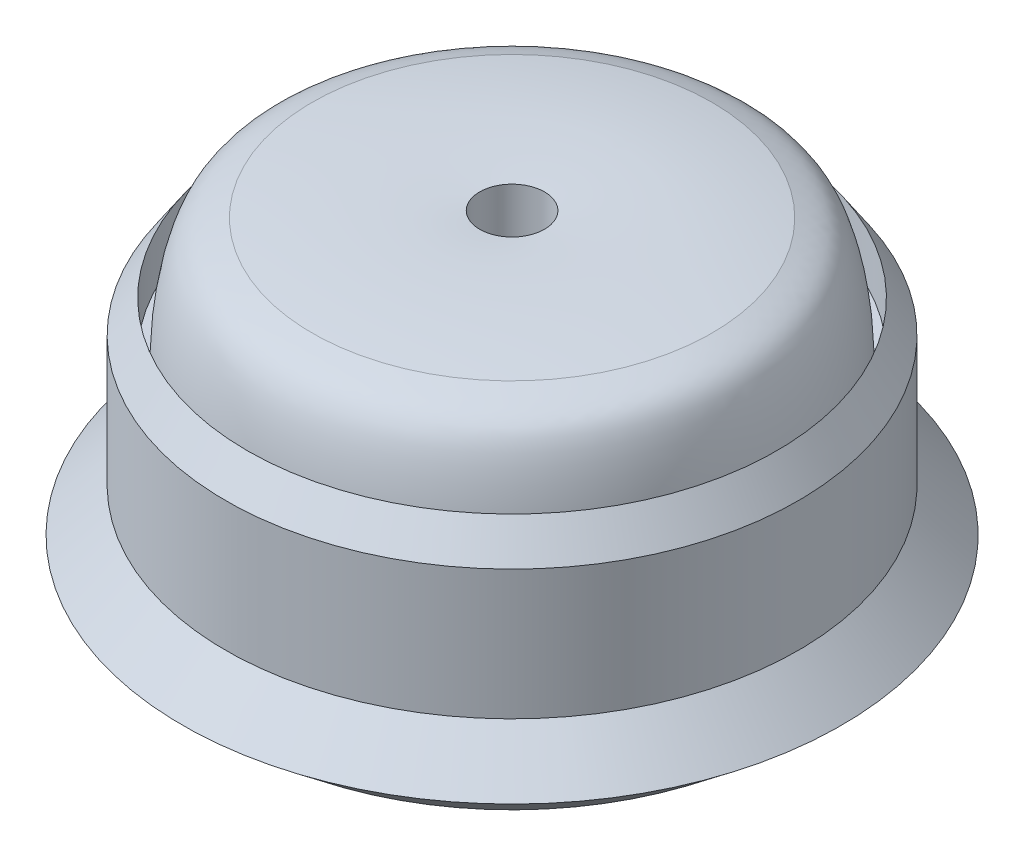
ISO-10303-21;
HEADER;
FILE_DESCRIPTION(('STEP AP214'),'2;1');
FILE_NAME('part.step','',(''),(''),'','','');
FILE_SCHEMA(('AUTOMOTIVE_DESIGN { 1 0 10303 214 1 1 1 1 }'));
ENDSEC;
DATA;
#1=APPLICATION_CONTEXT('core data for automotive mechanical design processes');
#2=APPLICATION_PROTOCOL_DEFINITION('international standard','automotive_design',2000,#1);
#3=PRODUCT_CONTEXT('',#1,'mechanical');
#4=PRODUCT('Part','Part','',(#3));
#5=PRODUCT_RELATED_PRODUCT_CATEGORY('part','',(#4));
#6=PRODUCT_DEFINITION_FORMATION('','',#4);
#7=PRODUCT_DEFINITION_CONTEXT('part definition',#1,'design');
#8=PRODUCT_DEFINITION('design','',#6,#7);
#9=PRODUCT_DEFINITION_SHAPE('','',#8);
#10=(LENGTH_UNIT() NAMED_UNIT(*) SI_UNIT(.MILLI.,.METRE.));
#11=(NAMED_UNIT(*) PLANE_ANGLE_UNIT() SI_UNIT($,.RADIAN.));
#12=(NAMED_UNIT(*) SI_UNIT($,.STERADIAN.) SOLID_ANGLE_UNIT());
#13=UNCERTAINTY_MEASURE_WITH_UNIT(LENGTH_MEASURE(1.E-05),#10,'distance_accuracy_value','');
#14=(GEOMETRIC_REPRESENTATION_CONTEXT(3) GLOBAL_UNCERTAINTY_ASSIGNED_CONTEXT((#13)) GLOBAL_UNIT_ASSIGNED_CONTEXT((#10,
#11,#12)) REPRESENTATION_CONTEXT('',''));
#15=CARTESIAN_POINT('',(0.,0.,0.));
#16=DIRECTION('',(0.,0.,1.));
#17=DIRECTION('',(1.,0.,0.));
#18=AXIS2_PLACEMENT_3D('',#15,#16,#17);
#19=CARTESIAN_POINT('',(18.5,29.4293040714932,0.));
#20=CARTESIAN_POINT('',(20.5119372775493,28.706105263246,0.));
#21=CARTESIAN_POINT('',(22.7386325654309,27.8723713239317,0.));
#22=CARTESIAN_POINT('',(23.7839045522029,20.5596077408684,0.));
#23=CARTESIAN_POINT('',(23.7,17.2047092559107,0.));
#24=B_SPLINE_CURVE_WITH_KNOTS('',3,(#19,#20,#21,#22,#23),.UNSPECIFIED.,.F.,.F.,(4,1,4),(0.,
0.382453263538425,1.),.UNSPECIFIED.);
#25=CARTESIAN_POINT('',(0.,0.,0.));
#26=DIRECTION('',(0.,-1.,0.));
#27=AXIS1_PLACEMENT('',#25,#26);
#28=SURFACE_OF_REVOLUTION('',#24,#27);
#29=CARTESIAN_POINT('',(0.,18.4216589861751,0.));
#30=DIRECTION('',(0.,-1.,0.));
#31=DIRECTION('',(0.,0.,-1.));
#32=AXIS2_PLACEMENT_3D('',#29,#30,#31);
#33=CIRCLE('',#32,23.7);
#34=CARTESIAN_POINT('',(0.,18.4216589861751,-23.7));
#35=VERTEX_POINT('',#34);
#36=EDGE_CURVE('E88',#35,#35,#33,.T.);
#37=ORIENTED_EDGE('',*,*,#36,.F.);
#38=EDGE_LOOP('',(#37));
#39=FACE_BOUND('',#38,.T.);
#40=CARTESIAN_POINT('',(0.,29.4293040714932,0.));
#41=DIRECTION('',(0.,-1.,0.));
#42=DIRECTION('',(0.,0.,-1.));
#43=AXIS2_PLACEMENT_3D('',#40,#41,#42);
#44=CIRCLE('',#43,18.5);
#45=CARTESIAN_POINT('',(0.,29.4293040714932,-18.5));
#46=VERTEX_POINT('',#45);
#47=EDGE_CURVE('E10',#46,#46,#44,.T.);
#48=ORIENTED_EDGE('',*,*,#47,.T.);
#49=EDGE_LOOP('',(#48));
#50=FACE_BOUND('',#49,.T.);
#51=ADVANCED_FACE('F35',(#39,#50),#28,.T.);
#52=CARTESIAN_POINT('',(3.,30.,0.));
#53=CARTESIAN_POINT('',(10.8040228911975,30.6291232917202,0.));
#54=CARTESIAN_POINT('',(18.5,29.4293040714932,0.));
#55=B_SPLINE_CURVE_WITH_KNOTS('',2,(#52,#53,#54),.UNSPECIFIED.,.F.,.F.,(3,3),(0.,1.),.UNSPECIFIED.);
#56=CARTESIAN_POINT('',(0.,0.,0.));
#57=DIRECTION('',(0.,-1.,0.));
#58=AXIS1_PLACEMENT('',#56,#57);
#59=SURFACE_OF_REVOLUTION('',#55,#58);
#60=ORIENTED_EDGE('',*,*,#47,.F.);
#61=EDGE_LOOP('',(#60));
#62=FACE_BOUND('',#61,.T.);
#63=CARTESIAN_POINT('',(0.,30.,0.));
#64=DIRECTION('',(0.,-1.,0.));
#65=DIRECTION('',(0.,0.,-1.));
#66=AXIS2_PLACEMENT_3D('',#63,#64,#65);
#67=CIRCLE('',#66,3.);
#68=CARTESIAN_POINT('',(0.,30.,-3.));
#69=VERTEX_POINT('',#68);
#70=EDGE_CURVE('E42',#69,#69,#67,.T.);
#71=ORIENTED_EDGE('',*,*,#70,.T.);
#72=EDGE_LOOP('',(#71));
#73=FACE_BOUND('',#72,.T.);
#74=ADVANCED_FACE('F100',(#62,#73),#59,.T.);
#75=CARTESIAN_POINT('',(0.,0.,0.));
#76=DIRECTION('',(0.,-1.,0.));
#77=DIRECTION('',(0.,0.,-1.));
#78=AXIS2_PLACEMENT_3D('',#75,#76,#77);
#79=CYLINDRICAL_SURFACE('',#78,3.);
#80=CARTESIAN_POINT('',(0.,25.2649769585254,0.));
#81=DIRECTION('',(0.,-1.,0.));
#82=DIRECTION('',(0.,0.,-1.));
#83=AXIS2_PLACEMENT_3D('',#80,#81,#82);
#84=CIRCLE('',#83,3.);
#85=CARTESIAN_POINT('',(0.,25.2649769585254,-3.));
#86=VERTEX_POINT('',#85);
#87=EDGE_CURVE('E46',#86,#86,#84,.T.);
#88=ORIENTED_EDGE('',*,*,#87,.T.);
#89=EDGE_LOOP('',(#88));
#90=FACE_BOUND('',#89,.T.);
#91=ORIENTED_EDGE('',*,*,#70,.F.);
#92=EDGE_LOOP('',(#91));
#93=FACE_BOUND('',#92,.T.);
#94=ADVANCED_FACE('F103',(#90,#93),#79,.F.);
#95=CARTESIAN_POINT('',(0.,25.2649769585254,0.));
#96=DIRECTION('',(0.,-1.,0.));
#97=DIRECTION('',(0.,0.,-1.));
#98=AXIS2_PLACEMENT_3D('',#95,#96,#97);
#99=PLANE('',#98);
#100=CARTESIAN_POINT('',(0.,25.2649769585254,0.));
#101=DIRECTION('',(0.,-1.,0.));
#102=DIRECTION('',(0.,0.,-1.));
#103=AXIS2_PLACEMENT_3D('',#100,#101,#102);
#104=CIRCLE('',#103,5.5);
#105=CARTESIAN_POINT('',(0.,25.2649769585254,-5.5));
#106=VERTEX_POINT('',#105);
#107=EDGE_CURVE('E50',#106,#106,#104,.T.);
#108=ORIENTED_EDGE('',*,*,#107,.T.);
#109=EDGE_LOOP('',(#108));
#110=FACE_BOUND('',#109,.T.);
#111=ORIENTED_EDGE('',*,*,#87,.F.);
#112=EDGE_LOOP('',(#111));
#113=FACE_BOUND('',#112,.T.);
#114=ADVANCED_FACE('F107',(#110,#113),#99,.T.);
#115=CARTESIAN_POINT('',(0.,0.,0.));
#116=DIRECTION('',(0.,-1.,0.));
#117=DIRECTION('',(0.,0.,-1.));
#118=AXIS2_PLACEMENT_3D('',#115,#116,#117);
#119=CYLINDRICAL_SURFACE('',#118,5.5);
#120=CARTESIAN_POINT('',(0.,28.,0.));
#121=DIRECTION('',(0.,-1.,0.));
#122=DIRECTION('',(0.,0.,-1.));
#123=AXIS2_PLACEMENT_3D('',#120,#121,#122);
#124=CIRCLE('',#123,5.5);
#125=CARTESIAN_POINT('',(0.,28.,-5.5));
#126=VERTEX_POINT('',#125);
#127=EDGE_CURVE('E55',#126,#126,#124,.T.);
#128=ORIENTED_EDGE('',*,*,#127,.T.);
#129=EDGE_LOOP('',(#128));
#130=FACE_BOUND('',#129,.T.);
#131=ORIENTED_EDGE('',*,*,#107,.F.);
#132=EDGE_LOOP('',(#131));
#133=FACE_BOUND('',#132,.T.);
#134=ADVANCED_FACE('F111',(#130,#133),#119,.T.);
#135=CARTESIAN_POINT('',(0.,28.,0.));
#136=DIRECTION('',(0.,-1.,0.));
#137=DIRECTION('',(0.,0.,-1.));
#138=AXIS2_PLACEMENT_3D('',#135,#136,#137);
#139=PLANE('',#138);
#140=CARTESIAN_POINT('',(0.,28.,0.));
#141=DIRECTION('',(0.,-1.,0.));
#142=DIRECTION('',(0.,0.,-1.));
#143=AXIS2_PLACEMENT_3D('',#140,#141,#142);
#144=CIRCLE('',#143,18.5);
#145=CARTESIAN_POINT('',(0.,28.,-18.5));
#146=VERTEX_POINT('',#145);
#147=EDGE_CURVE('E58',#146,#146,#144,.T.);
#148=ORIENTED_EDGE('',*,*,#147,.T.);
#149=EDGE_LOOP('',(#148));
#150=FACE_BOUND('',#149,.T.);
#151=ORIENTED_EDGE('',*,*,#127,.F.);
#152=EDGE_LOOP('',(#151));
#153=FACE_BOUND('',#152,.T.);
#154=ADVANCED_FACE('F115',(#150,#153),#139,.T.);
#155=CARTESIAN_POINT('',(0.,0.,0.));
#156=DIRECTION('',(0.,-1.,0.));
#157=DIRECTION('',(0.,0.,-1.));
#158=AXIS2_PLACEMENT_3D('',#155,#156,#157);
#159=CYLINDRICAL_SURFACE('',#158,18.5);
#160=CARTESIAN_POINT('',(0.,17.,0.));
#161=DIRECTION('',(0.,-1.,0.));
#162=DIRECTION('',(0.,0.,-1.));
#163=AXIS2_PLACEMENT_3D('',#160,#161,#162);
#164=CIRCLE('',#163,18.5);
#165=CARTESIAN_POINT('',(0.,17.,-18.5));
#166=VERTEX_POINT('',#165);
#167=EDGE_CURVE('E61',#166,#166,#164,.T.);
#168=ORIENTED_EDGE('',*,*,#167,.T.);
#169=EDGE_LOOP('',(#168));
#170=FACE_BOUND('',#169,.T.);
#171=ORIENTED_EDGE('',*,*,#147,.F.);
#172=EDGE_LOOP('',(#171));
#173=FACE_BOUND('',#172,.T.);
#174=ADVANCED_FACE('F119',(#170,#173),#159,.F.);
#175=CARTESIAN_POINT('',(0.,17.,0.));
#176=DIRECTION('',(0.,-1.,0.));
#177=DIRECTION('',(0.,0.,-1.));
#178=AXIS2_PLACEMENT_3D('',#175,#176,#177);
#179=PLANE('',#178);
#180=CARTESIAN_POINT('',(0.,17.,0.));
#181=DIRECTION('',(0.,-1.,0.));
#182=DIRECTION('',(0.,0.,-1.));
#183=AXIS2_PLACEMENT_3D('',#180,#181,#182);
#184=CIRCLE('',#183,22.5);
#185=CARTESIAN_POINT('',(0.,17.,-22.5));
#186=VERTEX_POINT('',#185);
#187=EDGE_CURVE('E64',#186,#186,#184,.T.);
#188=ORIENTED_EDGE('',*,*,#187,.T.);
#189=EDGE_LOOP('',(#188));
#190=FACE_BOUND('',#189,.T.);
#191=ORIENTED_EDGE('',*,*,#167,.F.);
#192=EDGE_LOOP('',(#191));
#193=FACE_BOUND('',#192,.T.);
#194=ADVANCED_FACE('F123',(#190,#193),#179,.T.);
#195=CARTESIAN_POINT('',(0.,0.,0.));
#196=DIRECTION('',(0.,-1.,0.));
#197=DIRECTION('',(0.,0.,-1.));
#198=AXIS2_PLACEMENT_3D('',#195,#196,#197);
#199=CYLINDRICAL_SURFACE('',#198,22.5);
#200=CARTESIAN_POINT('',(0.,0.,0.));
#201=DIRECTION('',(0.,-1.,0.));
#202=DIRECTION('',(0.,0.,-1.));
#203=AXIS2_PLACEMENT_3D('',#200,#201,#202);
#204=CIRCLE('',#203,22.5);
#205=CARTESIAN_POINT('',(0.,0.,-22.5));
#206=VERTEX_POINT('',#205);
#207=EDGE_CURVE('E67',#206,#206,#204,.T.);
#208=ORIENTED_EDGE('',*,*,#207,.T.);
#209=EDGE_LOOP('',(#208));
#210=FACE_BOUND('',#209,.T.);
#211=ORIENTED_EDGE('',*,*,#187,.F.);
#212=EDGE_LOOP('',(#211));
#213=FACE_BOUND('',#212,.T.);
#214=ADVANCED_FACE('F127',(#210,#213),#199,.F.);
#215=CARTESIAN_POINT('',(0.,0.,0.));
#216=DIRECTION('',(0.,-1.,0.));
#217=DIRECTION('',(0.,0.,-1.));
#218=AXIS2_PLACEMENT_3D('',#215,#216,#217);
#219=PLANE('',#218);
#220=CARTESIAN_POINT('',(0.,0.,0.));
#221=DIRECTION('',(0.,-1.,0.));
#222=DIRECTION('',(0.,0.,-1.));
#223=AXIS2_PLACEMENT_3D('',#220,#221,#222);
#224=CIRCLE('',#223,25.5);
#225=CARTESIAN_POINT('',(0.,0.,-25.5));
#226=VERTEX_POINT('',#225);
#227=EDGE_CURVE('E70',#226,#226,#224,.T.);
#228=ORIENTED_EDGE('',*,*,#227,.T.);
#229=EDGE_LOOP('',(#228));
#230=FACE_BOUND('',#229,.T.);
#231=ORIENTED_EDGE('',*,*,#207,.F.);
#232=EDGE_LOOP('',(#231));
#233=FACE_BOUND('',#232,.T.);
#234=ADVANCED_FACE('F131',(#230,#233),#219,.T.);
#235=CARTESIAN_POINT('',(0.,0.,0.));
#236=DIRECTION('',(0.,1.,0.));
#237=DIRECTION('',(0.,0.,1.));
#238=AXIS2_PLACEMENT_3D('',#235,#236,#237);
#239=CONICAL_SURFACE('',#238,25.5,0.896055384571344);
#240=CARTESIAN_POINT('',(0.,4.,0.));
#241=DIRECTION('',(0.,-1.,0.));
#242=DIRECTION('',(0.,0.,-1.));
#243=AXIS2_PLACEMENT_3D('',#240,#241,#242);
#244=CIRCLE('',#243,30.5);
#245=CARTESIAN_POINT('',(0.,4.,-30.5));
#246=VERTEX_POINT('',#245);
#247=EDGE_CURVE('E73',#246,#246,#244,.T.);
#248=ORIENTED_EDGE('',*,*,#247,.T.);
#249=EDGE_LOOP('',(#248));
#250=FACE_BOUND('',#249,.T.);
#251=ORIENTED_EDGE('',*,*,#227,.F.);
#252=EDGE_LOOP('',(#251));
#253=FACE_BOUND('',#252,.T.);
#254=ADVANCED_FACE('F135',(#250,#253),#239,.T.);
#255=CARTESIAN_POINT('',(0.,4.,0.));
#256=DIRECTION('',(0.,-1.,0.));
#257=DIRECTION('',(0.,0.,-1.));
#258=AXIS2_PLACEMENT_3D('',#255,#256,#257);
#259=CONICAL_SURFACE('',#258,30.5,0.785398163397449);
#260=CARTESIAN_POINT('',(0.,8.,0.));
#261=DIRECTION('',(0.,-1.,0.));
#262=DIRECTION('',(0.,0.,-1.));
#263=AXIS2_PLACEMENT_3D('',#260,#261,#262);
#264=CIRCLE('',#263,26.5);
#265=CARTESIAN_POINT('',(0.,8.,-26.5));
#266=VERTEX_POINT('',#265);
#267=EDGE_CURVE('E76',#266,#266,#264,.T.);
#268=ORIENTED_EDGE('',*,*,#267,.T.);
#269=EDGE_LOOP('',(#268));
#270=FACE_BOUND('',#269,.T.);
#271=ORIENTED_EDGE('',*,*,#247,.F.);
#272=EDGE_LOOP('',(#271));
#273=FACE_BOUND('',#272,.T.);
#274=ADVANCED_FACE('F139',(#270,#273),#259,.T.);
#275=CARTESIAN_POINT('',(0.,0.,0.));
#276=DIRECTION('',(0.,-1.,0.));
#277=DIRECTION('',(0.,0.,-1.));
#278=AXIS2_PLACEMENT_3D('',#275,#276,#277);
#279=CYLINDRICAL_SURFACE('',#278,26.5);
#280=CARTESIAN_POINT('',(0.,20.,0.));
#281=DIRECTION('',(0.,-1.,0.));
#282=DIRECTION('',(0.,0.,-1.));
#283=AXIS2_PLACEMENT_3D('',#280,#281,#282);
#284=CIRCLE('',#283,26.5);
#285=CARTESIAN_POINT('',(0.,20.,-26.5));
#286=VERTEX_POINT('',#285);
#287=EDGE_CURVE('E79',#286,#286,#284,.T.);
#288=ORIENTED_EDGE('',*,*,#287,.T.);
#289=EDGE_LOOP('',(#288));
#290=FACE_BOUND('',#289,.T.);
#291=ORIENTED_EDGE('',*,*,#267,.F.);
#292=EDGE_LOOP('',(#291));
#293=FACE_BOUND('',#292,.T.);
#294=ADVANCED_FACE('F143',(#290,#293),#279,.T.);
#295=CARTESIAN_POINT('',(0.,20.,0.));
#296=DIRECTION('',(0.,-1.,0.));
#297=DIRECTION('',(0.,0.,-1.));
#298=AXIS2_PLACEMENT_3D('',#295,#296,#297);
#299=CONICAL_SURFACE('',#298,26.5,0.588002603547567);
#300=CARTESIAN_POINT('',(0.,23.,0.));
#301=DIRECTION('',(0.,-1.,0.));
#302=DIRECTION('',(0.,0.,-1.));
#303=AXIS2_PLACEMENT_3D('',#300,#301,#302);
#304=CIRCLE('',#303,24.5);
#305=CARTESIAN_POINT('',(0.,23.,-24.5));
#306=VERTEX_POINT('',#305);
#307=EDGE_CURVE('E82',#306,#306,#304,.T.);
#308=ORIENTED_EDGE('',*,*,#307,.T.);
#309=EDGE_LOOP('',(#308));
#310=FACE_BOUND('',#309,.T.);
#311=ORIENTED_EDGE('',*,*,#287,.F.);
#312=EDGE_LOOP('',(#311));
#313=FACE_BOUND('',#312,.T.);
#314=ADVANCED_FACE('F147',(#310,#313),#299,.T.);
#315=CARTESIAN_POINT('',(0.,0.,0.));
#316=DIRECTION('',(0.,-1.,0.));
#317=DIRECTION('',(0.,0.,-1.));
#318=AXIS2_PLACEMENT_3D('',#315,#316,#317);
#319=CYLINDRICAL_SURFACE('',#318,24.5);
#320=CARTESIAN_POINT('',(0.,18.4216589861751,0.));
#321=DIRECTION('',(0.,-1.,0.));
#322=DIRECTION('',(0.,0.,-1.));
#323=AXIS2_PLACEMENT_3D('',#320,#321,#322);
#324=CIRCLE('',#323,24.5);
#325=CARTESIAN_POINT('',(0.,18.4216589861751,-24.5));
#326=VERTEX_POINT('',#325);
#327=EDGE_CURVE('E85',#326,#326,#324,.T.);
#328=ORIENTED_EDGE('',*,*,#327,.T.);
#329=EDGE_LOOP('',(#328));
#330=FACE_BOUND('',#329,.T.);
#331=ORIENTED_EDGE('',*,*,#307,.F.);
#332=EDGE_LOOP('',(#331));
#333=FACE_BOUND('',#332,.T.);
#334=ADVANCED_FACE('F151',(#330,#333),#319,.F.);
#335=CARTESIAN_POINT('',(0.,18.4216589861751,0.));
#336=DIRECTION('',(0.,1.,0.));
#337=DIRECTION('',(0.,0.,1.));
#338=AXIS2_PLACEMENT_3D('',#335,#336,#337);
#339=PLANE('',#338);
#340=ORIENTED_EDGE('',*,*,#36,.T.);
#341=EDGE_LOOP('',(#340));
#342=FACE_BOUND('',#341,.T.);
#343=ORIENTED_EDGE('',*,*,#327,.F.);
#344=EDGE_LOOP('',(#343));
#345=FACE_BOUND('',#344,.T.);
#346=ADVANCED_FACE('F155',(#342,#345),#339,.T.);
#347=CLOSED_SHELL('',(#51,#74,#94,#114,#134,#154,#174,#194,#214,#234,#254,#274,#294,#314,#334,#346));
#348=MANIFOLD_SOLID_BREP('B2',#347);
#349=ADVANCED_BREP_SHAPE_REPRESENTATION('',(#18,#348),#14);
#350=SHAPE_DEFINITION_REPRESENTATION(#9,#349);
ENDSEC;
END-ISO-10303-21;
